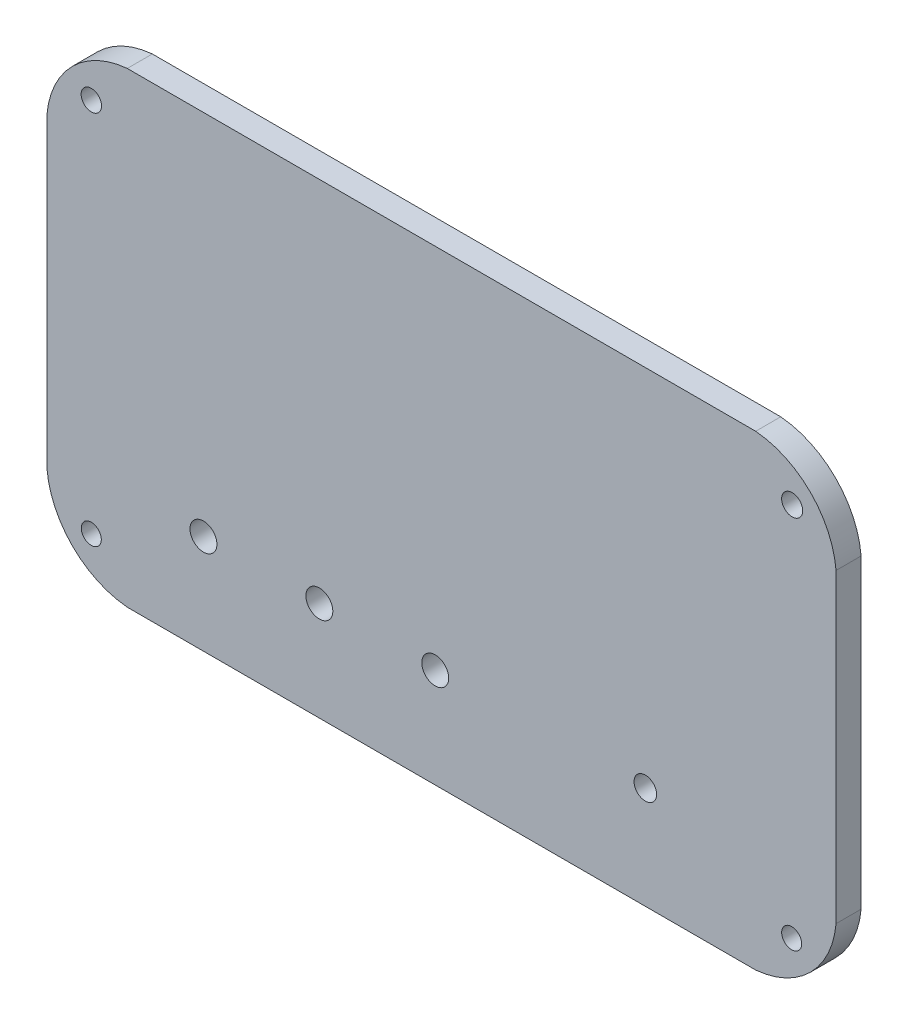
ISO-10303-21;
HEADER;
FILE_DESCRIPTION(('STEP AP214'),'2;1');
FILE_NAME('part.step','',(''),(''),'','','');
FILE_SCHEMA(('AUTOMOTIVE_DESIGN { 1 0 10303 214 1 1 1 1 }'));
ENDSEC;
DATA;
#1=APPLICATION_CONTEXT('core data for automotive mechanical design processes');
#2=APPLICATION_PROTOCOL_DEFINITION('international standard','automotive_design',2000,#1);
#3=PRODUCT_CONTEXT('',#1,'mechanical');
#4=PRODUCT('Part','Part','',(#3));
#5=PRODUCT_RELATED_PRODUCT_CATEGORY('part','',(#4));
#6=PRODUCT_DEFINITION_FORMATION('','',#4);
#7=PRODUCT_DEFINITION_CONTEXT('part definition',#1,'design');
#8=PRODUCT_DEFINITION('design','',#6,#7);
#9=PRODUCT_DEFINITION_SHAPE('','',#8);
#10=(LENGTH_UNIT() NAMED_UNIT(*) SI_UNIT(.MILLI.,.METRE.));
#11=(NAMED_UNIT(*) PLANE_ANGLE_UNIT() SI_UNIT($,.RADIAN.));
#12=(NAMED_UNIT(*) SI_UNIT($,.STERADIAN.) SOLID_ANGLE_UNIT());
#13=UNCERTAINTY_MEASURE_WITH_UNIT(LENGTH_MEASURE(1.E-05),#10,'distance_accuracy_value','');
#14=(GEOMETRIC_REPRESENTATION_CONTEXT(3) GLOBAL_UNCERTAINTY_ASSIGNED_CONTEXT((#13)) GLOBAL_UNIT_ASSIGNED_CONTEXT((#10,
#11,#12)) REPRESENTATION_CONTEXT('',''));
#15=CARTESIAN_POINT('',(0.,0.,0.));
#16=DIRECTION('',(0.,0.,1.));
#17=DIRECTION('',(1.,0.,0.));
#18=AXIS2_PLACEMENT_3D('',#15,#16,#17);
#19=CARTESIAN_POINT('',(48.9504839953527,24.6545343401466,4.));
#20=DIRECTION('',(0.,0.,-1.));
#21=DIRECTION('',(-1.,0.,0.));
#22=AXIS2_PLACEMENT_3D('',#19,#20,#21);
#23=CYLINDRICAL_SURFACE('',#22,14.1023275814752);
#24=CARTESIAN_POINT('',(48.9504839953527,24.6545343401466,0.));
#25=DIRECTION('',(0.,0.,1.));
#26=DIRECTION('',(-1.,0.,0.));
#27=AXIS2_PLACEMENT_3D('',#24,#25,#26);
#28=CIRCLE('',#27,14.1023275814752);
#29=CARTESIAN_POINT('',(63.,25.873855155353,0.));
#30=VERTEX_POINT('',#29);
#31=CARTESIAN_POINT('',(50.1698048105594,38.7040503447938,0.));
#32=VERTEX_POINT('',#31);
#33=EDGE_CURVE('E131',#30,#32,#28,.T.);
#34=ORIENTED_EDGE('',*,*,#33,.T.);
#35=DIRECTION('',(0.,0.,-1.));
#36=VECTOR('',#35,1.);
#37=CARTESIAN_POINT('',(50.1698048105594,38.7040503447938,4.));
#38=LINE('',#37,#36);
#39=CARTESIAN_POINT('',(50.1698048105594,38.7040503447938,4.));
#40=VERTEX_POINT('',#39);
#41=EDGE_CURVE('E11',#40,#32,#38,.T.);
#42=ORIENTED_EDGE('',*,*,#41,.F.);
#43=CARTESIAN_POINT('',(48.9504839953527,24.6545343401466,4.));
#44=DIRECTION('',(0.,0.,1.));
#45=DIRECTION('',(-1.,0.,0.));
#46=AXIS2_PLACEMENT_3D('',#43,#44,#45);
#47=CIRCLE('',#46,14.1023275814752);
#48=CARTESIAN_POINT('',(63.,25.873855155353,4.));
#49=VERTEX_POINT('',#48);
#50=EDGE_CURVE('E146',#49,#40,#47,.T.);
#51=ORIENTED_EDGE('',*,*,#50,.F.);
#52=DIRECTION('',(0.,0.,-1.));
#53=VECTOR('',#52,1.);
#54=CARTESIAN_POINT('',(63.,25.873855155353,4.));
#55=LINE('',#54,#53);
#56=EDGE_CURVE('E127',#49,#30,#55,.T.);
#57=ORIENTED_EDGE('',*,*,#56,.T.);
#58=EDGE_LOOP('',(#34,#42,#51,#57));
#59=FACE_BOUND('',#58,.T.);
#60=ADVANCED_FACE('F35',(#59),#23,.T.);
#61=CARTESIAN_POINT('',(50.1698048105594,38.7040503447938,4.));
#62=DIRECTION('',(0.,-1.,0.));
#63=DIRECTION('',(0.,0.,-1.));
#64=AXIS2_PLACEMENT_3D('',#61,#62,#63);
#65=PLANE('',#64);
#66=DIRECTION('',(-1.,0.,0.));
#67=VECTOR('',#66,1.);
#68=CARTESIAN_POINT('',(50.1698048105594,38.7040503447938,0.));
#69=LINE('',#68,#67);
#70=CARTESIAN_POINT('',(-50.1698048105592,38.7040503447938,0.));
#71=VERTEX_POINT('',#70);
#72=EDGE_CURVE('E134',#32,#71,#69,.T.);
#73=ORIENTED_EDGE('',*,*,#72,.T.);
#74=DIRECTION('',(0.,0.,-1.));
#75=VECTOR('',#74,1.);
#76=CARTESIAN_POINT('',(-50.1698048105592,38.7040503447938,4.));
#77=LINE('',#76,#75);
#78=CARTESIAN_POINT('',(-50.1698048105592,38.7040503447938,4.));
#79=VERTEX_POINT('',#78);
#80=EDGE_CURVE('E43',#79,#71,#77,.T.);
#81=ORIENTED_EDGE('',*,*,#80,.F.);
#82=DIRECTION('',(-1.,0.,0.));
#83=VECTOR('',#82,1.);
#84=CARTESIAN_POINT('',(50.1698048105594,38.7040503447938,4.));
#85=LINE('',#84,#83);
#86=EDGE_CURVE('E94',#40,#79,#85,.T.);
#87=ORIENTED_EDGE('',*,*,#86,.F.);
#88=ORIENTED_EDGE('',*,*,#41,.T.);
#89=EDGE_LOOP('',(#73,#81,#87,#88));
#90=FACE_BOUND('',#89,.T.);
#91=ADVANCED_FACE('F269',(#90),#65,.F.);
#92=CARTESIAN_POINT('',(-48.9504839953527,24.6545343401465,4.));
#93=DIRECTION('',(0.,0.,-1.));
#94=DIRECTION('',(-1.,0.,0.));
#95=AXIS2_PLACEMENT_3D('',#92,#93,#94);
#96=CYLINDRICAL_SURFACE('',#95,14.1023275814752);
#97=CARTESIAN_POINT('',(-48.9504839953527,24.6545343401465,0.));
#98=DIRECTION('',(0.,0.,1.));
#99=DIRECTION('',(1.,0.,0.));
#100=AXIS2_PLACEMENT_3D('',#97,#98,#99);
#101=CIRCLE('',#100,14.1023275814752);
#102=CARTESIAN_POINT('',(-63.,25.873855155353,0.));
#103=VERTEX_POINT('',#102);
#104=EDGE_CURVE('E137',#71,#103,#101,.T.);
#105=ORIENTED_EDGE('',*,*,#104,.T.);
#106=DIRECTION('',(0.,0.,-1.));
#107=VECTOR('',#106,1.);
#108=CARTESIAN_POINT('',(-63.,25.873855155353,4.));
#109=LINE('',#108,#107);
#110=CARTESIAN_POINT('',(-63.,25.873855155353,4.));
#111=VERTEX_POINT('',#110);
#112=EDGE_CURVE('E153',#111,#103,#109,.T.);
#113=ORIENTED_EDGE('',*,*,#112,.F.);
#114=CARTESIAN_POINT('',(-48.9504839953527,24.6545343401465,4.));
#115=DIRECTION('',(0.,0.,1.));
#116=DIRECTION('',(1.,0.,0.));
#117=AXIS2_PLACEMENT_3D('',#114,#115,#116);
#118=CIRCLE('',#117,14.1023275814752);
#119=EDGE_CURVE('E161',#79,#111,#118,.T.);
#120=ORIENTED_EDGE('',*,*,#119,.F.);
#121=ORIENTED_EDGE('',*,*,#80,.T.);
#122=EDGE_LOOP('',(#105,#113,#120,#121));
#123=FACE_BOUND('',#122,.T.);
#124=ADVANCED_FACE('F159',(#123),#96,.T.);
#125=CARTESIAN_POINT('',(-63.,25.873855155353,4.));
#126=DIRECTION('',(1.,0.,0.));
#127=DIRECTION('',(0.,0.,-1.));
#128=AXIS2_PLACEMENT_3D('',#125,#126,#127);
#129=PLANE('',#128);
#130=DIRECTION('',(0.,-1.,0.));
#131=VECTOR('',#130,1.);
#132=CARTESIAN_POINT('',(-63.,25.873855155353,0.));
#133=LINE('',#132,#131);
#134=CARTESIAN_POINT('',(-63.,-22.9657544657653,0.));
#135=VERTEX_POINT('',#134);
#136=EDGE_CURVE('E139',#103,#135,#133,.T.);
#137=ORIENTED_EDGE('',*,*,#136,.T.);
#138=DIRECTION('',(0.,0.,-1.));
#139=VECTOR('',#138,1.);
#140=CARTESIAN_POINT('',(-63.,-22.9657544657653,4.));
#141=LINE('',#140,#139);
#142=CARTESIAN_POINT('',(-63.,-22.9657544657653,4.));
#143=VERTEX_POINT('',#142);
#144=EDGE_CURVE('E150',#143,#135,#141,.T.);
#145=ORIENTED_EDGE('',*,*,#144,.F.);
#146=DIRECTION('',(0.,-1.,0.));
#147=VECTOR('',#146,1.);
#148=CARTESIAN_POINT('',(-63.,25.873855155353,4.));
#149=LINE('',#148,#147);
#150=EDGE_CURVE('E173',#111,#143,#149,.T.);
#151=ORIENTED_EDGE('',*,*,#150,.F.);
#152=ORIENTED_EDGE('',*,*,#112,.T.);
#153=EDGE_LOOP('',(#137,#145,#151,#152));
#154=FACE_BOUND('',#153,.T.);
#155=ADVANCED_FACE('F169',(#154),#129,.F.);
#156=CARTESIAN_POINT('',(-48.9504839953527,-21.7464336505589,4.));
#157=DIRECTION('',(0.,0.,-1.));
#158=DIRECTION('',(-1.,0.,0.));
#159=AXIS2_PLACEMENT_3D('',#156,#157,#158);
#160=CYLINDRICAL_SURFACE('',#159,14.1023275814752);
#161=CARTESIAN_POINT('',(-48.9504839953527,-21.7464336505589,0.));
#162=DIRECTION('',(0.,0.,1.));
#163=DIRECTION('',(-1.,0.,0.));
#164=AXIS2_PLACEMENT_3D('',#161,#162,#163);
#165=CIRCLE('',#164,14.1023275814752);
#166=CARTESIAN_POINT('',(-50.1698048105591,-35.7959496552062,0.));
#167=VERTEX_POINT('',#166);
#168=EDGE_CURVE('E141',#135,#167,#165,.T.);
#169=ORIENTED_EDGE('',*,*,#168,.T.);
#170=DIRECTION('',(0.,0.,-1.));
#171=VECTOR('',#170,1.);
#172=CARTESIAN_POINT('',(-50.1698048105591,-35.7959496552062,4.));
#173=LINE('',#172,#171);
#174=CARTESIAN_POINT('',(-50.1698048105591,-35.7959496552062,4.));
#175=VERTEX_POINT('',#174);
#176=EDGE_CURVE('E122',#175,#167,#173,.T.);
#177=ORIENTED_EDGE('',*,*,#176,.F.);
#178=CARTESIAN_POINT('',(-48.9504839953527,-21.7464336505589,4.));
#179=DIRECTION('',(0.,0.,1.));
#180=DIRECTION('',(-1.,0.,0.));
#181=AXIS2_PLACEMENT_3D('',#178,#179,#180);
#182=CIRCLE('',#181,14.1023275814752);
#183=EDGE_CURVE('E113',#143,#175,#182,.T.);
#184=ORIENTED_EDGE('',*,*,#183,.F.);
#185=ORIENTED_EDGE('',*,*,#144,.T.);
#186=EDGE_LOOP('',(#169,#177,#184,#185));
#187=FACE_BOUND('',#186,.T.);
#188=ADVANCED_FACE('F172',(#187),#160,.T.);
#189=CARTESIAN_POINT('',(-50.1698048105592,-35.7959496552062,4.));
#190=DIRECTION('',(0.,1.,0.));
#191=DIRECTION('',(0.,0.,1.));
#192=AXIS2_PLACEMENT_3D('',#189,#190,#191);
#193=PLANE('',#192);
#194=DIRECTION('',(1.,0.,0.));
#195=VECTOR('',#194,1.);
#196=CARTESIAN_POINT('',(-50.1698048105592,-35.7959496552062,0.));
#197=LINE('',#196,#195);
#198=CARTESIAN_POINT('',(50.1698048105594,-35.7959496552062,0.));
#199=VERTEX_POINT('',#198);
#200=EDGE_CURVE('E121',#167,#199,#197,.T.);
#201=ORIENTED_EDGE('',*,*,#200,.T.);
#202=DIRECTION('',(0.,0.,-1.));
#203=VECTOR('',#202,1.);
#204=CARTESIAN_POINT('',(50.1698048105594,-35.7959496552062,4.));
#205=LINE('',#204,#203);
#206=CARTESIAN_POINT('',(50.1698048105594,-35.7959496552062,4.));
#207=VERTEX_POINT('',#206);
#208=EDGE_CURVE('E118',#207,#199,#205,.T.);
#209=ORIENTED_EDGE('',*,*,#208,.F.);
#210=DIRECTION('',(1.,0.,0.));
#211=VECTOR('',#210,1.);
#212=CARTESIAN_POINT('',(-50.1698048105592,-35.7959496552062,4.));
#213=LINE('',#212,#211);
#214=EDGE_CURVE('E107',#175,#207,#213,.T.);
#215=ORIENTED_EDGE('',*,*,#214,.F.);
#216=ORIENTED_EDGE('',*,*,#176,.T.);
#217=EDGE_LOOP('',(#201,#209,#215,#216));
#218=FACE_BOUND('',#217,.T.);
#219=ADVANCED_FACE('F119',(#218),#193,.F.);
#220=CARTESIAN_POINT('',(48.9504839953527,-21.7464336505589,4.));
#221=DIRECTION('',(0.,0.,-1.));
#222=DIRECTION('',(-1.,0.,0.));
#223=AXIS2_PLACEMENT_3D('',#220,#221,#222);
#224=CYLINDRICAL_SURFACE('',#223,14.1023275814752);
#225=CARTESIAN_POINT('',(48.9504839953527,-21.7464336505589,0.));
#226=DIRECTION('',(0.,0.,1.));
#227=DIRECTION('',(1.,0.,0.));
#228=AXIS2_PLACEMENT_3D('',#225,#226,#227);
#229=CIRCLE('',#228,14.1023275814752);
#230=CARTESIAN_POINT('',(63.,-22.9657544657653,0.));
#231=VERTEX_POINT('',#230);
#232=EDGE_CURVE('E80',#199,#231,#229,.T.);
#233=ORIENTED_EDGE('',*,*,#232,.T.);
#234=DIRECTION('',(0.,0.,-1.));
#235=VECTOR('',#234,1.);
#236=CARTESIAN_POINT('',(63.,-22.9657544657653,4.));
#237=LINE('',#236,#235);
#238=CARTESIAN_POINT('',(63.,-22.9657544657653,4.));
#239=VERTEX_POINT('',#238);
#240=EDGE_CURVE('E123',#239,#231,#237,.T.);
#241=ORIENTED_EDGE('',*,*,#240,.F.);
#242=CARTESIAN_POINT('',(48.9504839953527,-21.7464336505589,4.));
#243=DIRECTION('',(0.,0.,1.));
#244=DIRECTION('',(1.,0.,0.));
#245=AXIS2_PLACEMENT_3D('',#242,#243,#244);
#246=CIRCLE('',#245,14.1023275814752);
#247=EDGE_CURVE('E111',#207,#239,#246,.T.);
#248=ORIENTED_EDGE('',*,*,#247,.F.);
#249=ORIENTED_EDGE('',*,*,#208,.T.);
#250=EDGE_LOOP('',(#233,#241,#248,#249));
#251=FACE_BOUND('',#250,.T.);
#252=ADVANCED_FACE('F125',(#251),#224,.T.);
#253=CARTESIAN_POINT('',(63.,-22.9657544657653,4.));
#254=DIRECTION('',(-1.,0.,0.));
#255=DIRECTION('',(0.,0.,1.));
#256=AXIS2_PLACEMENT_3D('',#253,#254,#255);
#257=PLANE('',#256);
#258=DIRECTION('',(0.,1.,0.));
#259=VECTOR('',#258,1.);
#260=CARTESIAN_POINT('',(63.,-22.9657544657653,0.));
#261=LINE('',#260,#259);
#262=EDGE_CURVE('E86',#231,#30,#261,.T.);
#263=ORIENTED_EDGE('',*,*,#262,.T.);
#264=ORIENTED_EDGE('',*,*,#56,.F.);
#265=DIRECTION('',(0.,1.,0.));
#266=VECTOR('',#265,1.);
#267=CARTESIAN_POINT('',(63.,-22.9657544657653,4.));
#268=LINE('',#267,#266);
#269=EDGE_CURVE('E51',#239,#49,#268,.T.);
#270=ORIENTED_EDGE('',*,*,#269,.F.);
#271=ORIENTED_EDGE('',*,*,#240,.T.);
#272=EDGE_LOOP('',(#263,#264,#270,#271));
#273=FACE_BOUND('',#272,.T.);
#274=ADVANCED_FACE('F259',(#273),#257,.F.);
#275=CARTESIAN_POINT('',(48.9504839953527,24.6545343401466,4.));
#276=DIRECTION('',(0.,0.,-1.));
#277=DIRECTION('',(-1.,0.,0.));
#278=AXIS2_PLACEMENT_3D('',#275,#276,#277);
#279=PLANE('',#278);
#280=CARTESIAN_POINT('',(-55.9052456302012,31.455233255895,4.));
#281=DIRECTION('',(0.,0.,-1.));
#282=DIRECTION('',(-1.,0.,0.));
#283=AXIS2_PLACEMENT_3D('',#280,#281,#282);
#284=CIRCLE('',#283,1.63184694028027);
#285=CARTESIAN_POINT('',(-57.5370925704815,31.455233255895,4.));
#286=VERTEX_POINT('',#285);
#287=EDGE_CURVE('E206',#286,#286,#284,.T.);
#288=ORIENTED_EDGE('',*,*,#287,.T.);
#289=EDGE_LOOP('',(#288));
#290=FACE_BOUND('',#289,.T.);
#291=CARTESIAN_POINT('',(55.9150267097706,-28.5168248430726,4.));
#292=DIRECTION('',(0.,0.,-1.));
#293=DIRECTION('',(-1.,0.,0.));
#294=AXIS2_PLACEMENT_3D('',#291,#292,#293);
#295=CIRCLE('',#294,1.59999999999996);
#296=CARTESIAN_POINT('',(54.3150267097706,-28.5168248430726,4.));
#297=VERTEX_POINT('',#296);
#298=EDGE_CURVE('E212',#297,#297,#295,.T.);
#299=ORIENTED_EDGE('',*,*,#298,.T.);
#300=EDGE_LOOP('',(#299));
#301=FACE_BOUND('',#300,.T.);
#302=CARTESIAN_POINT('',(-55.9150267097706,-28.5168248430726,4.));
#303=DIRECTION('',(0.,0.,-1.));
#304=DIRECTION('',(-1.,0.,0.));
#305=AXIS2_PLACEMENT_3D('',#302,#303,#304);
#306=CIRCLE('',#305,1.59999999999999);
#307=CARTESIAN_POINT('',(-57.5150267097706,-28.5168248430726,4.));
#308=VERTEX_POINT('',#307);
#309=EDGE_CURVE('E213',#308,#308,#306,.T.);
#310=ORIENTED_EDGE('',*,*,#309,.T.);
#311=EDGE_LOOP('',(#310));
#312=FACE_BOUND('',#311,.T.);
#313=CARTESIAN_POINT('',(55.9916196523817,31.455233255895,4.));
#314=DIRECTION('',(0.,0.,-1.));
#315=DIRECTION('',(-1.,0.,0.));
#316=AXIS2_PLACEMENT_3D('',#313,#314,#315);
#317=CIRCLE('',#316,1.68237123514881);
#318=CARTESIAN_POINT('',(54.3092484172328,31.455233255895,4.));
#319=VERTEX_POINT('',#318);
#320=EDGE_CURVE('E196',#319,#319,#317,.T.);
#321=ORIENTED_EDGE('',*,*,#320,.T.);
#322=EDGE_LOOP('',(#321));
#323=FACE_BOUND('',#322,.T.);
#324=CARTESIAN_POINT('',(-38.,-19.9459496552062,4.));
#325=DIRECTION('',(0.,0.,1.));
#326=DIRECTION('',(1.,0.,0.));
#327=AXIS2_PLACEMENT_3D('',#324,#325,#326);
#328=CIRCLE('',#327,2.15);
#329=CARTESIAN_POINT('',(-35.85,-19.9459496552062,4.));
#330=VERTEX_POINT('',#329);
#331=EDGE_CURVE('E192',#330,#330,#328,.T.);
#332=ORIENTED_EDGE('',*,*,#331,.F.);
#333=EDGE_LOOP('',(#332));
#334=FACE_BOUND('',#333,.T.);
#335=CARTESIAN_POINT('',(-1.00000000000003,-19.9459496552062,4.));
#336=DIRECTION('',(0.,0.,1.));
#337=DIRECTION('',(1.,0.,0.));
#338=AXIS2_PLACEMENT_3D('',#335,#336,#337);
#339=CIRCLE('',#338,2.15);
#340=CARTESIAN_POINT('',(1.14999999999997,-19.9459496552062,4.));
#341=VERTEX_POINT('',#340);
#342=EDGE_CURVE('E193',#341,#341,#339,.T.);
#343=ORIENTED_EDGE('',*,*,#342,.F.);
#344=EDGE_LOOP('',(#343));
#345=FACE_BOUND('',#344,.T.);
#346=CARTESIAN_POINT('',(-19.5,-19.9459496552062,4.));
#347=DIRECTION('',(0.,0.,1.));
#348=DIRECTION('',(1.,0.,0.));
#349=AXIS2_PLACEMENT_3D('',#346,#347,#348);
#350=CIRCLE('',#349,2.15);
#351=CARTESIAN_POINT('',(-17.35,-19.9459496552062,4.));
#352=VERTEX_POINT('',#351);
#353=EDGE_CURVE('E179',#352,#352,#350,.T.);
#354=ORIENTED_EDGE('',*,*,#353,.F.);
#355=EDGE_LOOP('',(#354));
#356=FACE_BOUND('',#355,.T.);
#357=CARTESIAN_POINT('',(32.5542275212656,-19.4425109087948,4.));
#358=DIRECTION('',(0.,0.,1.));
#359=DIRECTION('',(1.,0.,0.));
#360=AXIS2_PLACEMENT_3D('',#357,#358,#359);
#361=CIRCLE('',#360,1.8);
#362=CARTESIAN_POINT('',(34.3542275212656,-19.4425109087948,4.));
#363=VERTEX_POINT('',#362);
#364=EDGE_CURVE('E186',#363,#363,#361,.T.);
#365=ORIENTED_EDGE('',*,*,#364,.F.);
#366=EDGE_LOOP('',(#365));
#367=FACE_BOUND('',#366,.T.);
#368=ORIENTED_EDGE('',*,*,#50,.T.);
#369=ORIENTED_EDGE('',*,*,#86,.T.);
#370=ORIENTED_EDGE('',*,*,#119,.T.);
#371=ORIENTED_EDGE('',*,*,#150,.T.);
#372=ORIENTED_EDGE('',*,*,#183,.T.);
#373=ORIENTED_EDGE('',*,*,#214,.T.);
#374=ORIENTED_EDGE('',*,*,#247,.T.);
#375=ORIENTED_EDGE('',*,*,#269,.T.);
#376=EDGE_LOOP('',(#368,#369,#370,#371,#372,#373,#374,#375));
#377=FACE_BOUND('',#376,.T.);
#378=ADVANCED_FACE('F109',(#290,#301,#312,#323,#334,#345,#356,#367,#377),#279,.F.);
#379=CARTESIAN_POINT('',(48.9504839953527,24.6545343401466,0.));
#380=DIRECTION('',(0.,0.,-1.));
#381=DIRECTION('',(-1.,0.,0.));
#382=AXIS2_PLACEMENT_3D('',#379,#380,#381);
#383=PLANE('',#382);
#384=CARTESIAN_POINT('',(-55.9052456302012,31.455233255895,0.));
#385=DIRECTION('',(0.,0.,-1.));
#386=DIRECTION('',(-1.,0.,0.));
#387=AXIS2_PLACEMENT_3D('',#384,#385,#386);
#388=CIRCLE('',#387,1.63184694028027);
#389=CARTESIAN_POINT('',(-57.5370925704815,31.455233255895,0.));
#390=VERTEX_POINT('',#389);
#391=EDGE_CURVE('E216',#390,#390,#388,.T.);
#392=ORIENTED_EDGE('',*,*,#391,.F.);
#393=EDGE_LOOP('',(#392));
#394=FACE_BOUND('',#393,.T.);
#395=CARTESIAN_POINT('',(55.9150267097706,-28.5168248430726,0.));
#396=DIRECTION('',(0.,0.,-1.));
#397=DIRECTION('',(-1.,0.,0.));
#398=AXIS2_PLACEMENT_3D('',#395,#396,#397);
#399=CIRCLE('',#398,1.59999999999996);
#400=CARTESIAN_POINT('',(54.3150267097706,-28.5168248430726,0.));
#401=VERTEX_POINT('',#400);
#402=EDGE_CURVE('E209',#401,#401,#399,.T.);
#403=ORIENTED_EDGE('',*,*,#402,.F.);
#404=EDGE_LOOP('',(#403));
#405=FACE_BOUND('',#404,.T.);
#406=CARTESIAN_POINT('',(-55.9150267097706,-28.5168248430726,0.));
#407=DIRECTION('',(0.,0.,-1.));
#408=DIRECTION('',(-1.,0.,0.));
#409=AXIS2_PLACEMENT_3D('',#406,#407,#408);
#410=CIRCLE('',#409,1.59999999999999);
#411=CARTESIAN_POINT('',(-57.5150267097706,-28.5168248430726,0.));
#412=VERTEX_POINT('',#411);
#413=EDGE_CURVE('E221',#412,#412,#410,.T.);
#414=ORIENTED_EDGE('',*,*,#413,.F.);
#415=EDGE_LOOP('',(#414));
#416=FACE_BOUND('',#415,.T.);
#417=CARTESIAN_POINT('',(55.9916196523817,31.455233255895,0.));
#418=DIRECTION('',(0.,0.,-1.));
#419=DIRECTION('',(-1.,0.,0.));
#420=AXIS2_PLACEMENT_3D('',#417,#418,#419);
#421=CIRCLE('',#420,1.68237123514881);
#422=CARTESIAN_POINT('',(54.3092484172328,31.455233255895,0.));
#423=VERTEX_POINT('',#422);
#424=EDGE_CURVE('E203',#423,#423,#421,.T.);
#425=ORIENTED_EDGE('',*,*,#424,.F.);
#426=EDGE_LOOP('',(#425));
#427=FACE_BOUND('',#426,.T.);
#428=CARTESIAN_POINT('',(-38.,-19.9459496552062,0.));
#429=DIRECTION('',(0.,0.,1.));
#430=DIRECTION('',(1.,0.,0.));
#431=AXIS2_PLACEMENT_3D('',#428,#429,#430);
#432=CIRCLE('',#431,2.15);
#433=CARTESIAN_POINT('',(-35.85,-19.9459496552062,0.));
#434=VERTEX_POINT('',#433);
#435=EDGE_CURVE('E135',#434,#434,#432,.T.);
#436=ORIENTED_EDGE('',*,*,#435,.T.);
#437=EDGE_LOOP('',(#436));
#438=FACE_BOUND('',#437,.T.);
#439=CARTESIAN_POINT('',(-1.00000000000003,-19.9459496552062,0.));
#440=DIRECTION('',(0.,0.,1.));
#441=DIRECTION('',(1.,0.,0.));
#442=AXIS2_PLACEMENT_3D('',#439,#440,#441);
#443=CIRCLE('',#442,2.15);
#444=CARTESIAN_POINT('',(1.14999999999997,-19.9459496552062,0.));
#445=VERTEX_POINT('',#444);
#446=EDGE_CURVE('E183',#445,#445,#443,.T.);
#447=ORIENTED_EDGE('',*,*,#446,.T.);
#448=EDGE_LOOP('',(#447));
#449=FACE_BOUND('',#448,.T.);
#450=CARTESIAN_POINT('',(-19.5,-19.9459496552062,0.));
#451=DIRECTION('',(0.,0.,1.));
#452=DIRECTION('',(1.,0.,0.));
#453=AXIS2_PLACEMENT_3D('',#450,#451,#452);
#454=CIRCLE('',#453,2.15);
#455=CARTESIAN_POINT('',(-17.35,-19.9459496552062,0.));
#456=VERTEX_POINT('',#455);
#457=EDGE_CURVE('E182',#456,#456,#454,.T.);
#458=ORIENTED_EDGE('',*,*,#457,.T.);
#459=EDGE_LOOP('',(#458));
#460=FACE_BOUND('',#459,.T.);
#461=CARTESIAN_POINT('',(32.5542275212656,-19.4425109087948,0.));
#462=DIRECTION('',(0.,0.,1.));
#463=DIRECTION('',(1.,0.,0.));
#464=AXIS2_PLACEMENT_3D('',#461,#462,#463);
#465=CIRCLE('',#464,1.8);
#466=CARTESIAN_POINT('',(34.3542275212656,-19.4425109087948,0.));
#467=VERTEX_POINT('',#466);
#468=EDGE_CURVE('E189',#467,#467,#465,.T.);
#469=ORIENTED_EDGE('',*,*,#468,.T.);
#470=EDGE_LOOP('',(#469));
#471=FACE_BOUND('',#470,.T.);
#472=ORIENTED_EDGE('',*,*,#33,.F.);
#473=ORIENTED_EDGE('',*,*,#262,.F.);
#474=ORIENTED_EDGE('',*,*,#232,.F.);
#475=ORIENTED_EDGE('',*,*,#200,.F.);
#476=ORIENTED_EDGE('',*,*,#168,.F.);
#477=ORIENTED_EDGE('',*,*,#136,.F.);
#478=ORIENTED_EDGE('',*,*,#104,.F.);
#479=ORIENTED_EDGE('',*,*,#72,.F.);
#480=EDGE_LOOP('',(#472,#473,#474,#475,#476,#477,#478,#479));
#481=FACE_BOUND('',#480,.T.);
#482=ADVANCED_FACE('F165',(#394,#405,#416,#427,#438,#449,#460,#471,#481),#383,.T.);
#483=CARTESIAN_POINT('',(32.5542275212656,-19.4425109087948,0.));
#484=DIRECTION('',(0.,0.,1.));
#485=DIRECTION('',(1.,0.,0.));
#486=AXIS2_PLACEMENT_3D('',#483,#484,#485);
#487=CYLINDRICAL_SURFACE('',#486,1.8);
#488=ORIENTED_EDGE('',*,*,#468,.F.);
#489=EDGE_LOOP('',(#488));
#490=FACE_BOUND('',#489,.T.);
#491=ORIENTED_EDGE('',*,*,#364,.T.);
#492=EDGE_LOOP('',(#491));
#493=FACE_BOUND('',#492,.T.);
#494=ADVANCED_FACE('F239',(#490,#493),#487,.F.);
#495=CARTESIAN_POINT('',(-19.5,-19.9459496552062,0.));
#496=DIRECTION('',(0.,0.,1.));
#497=DIRECTION('',(1.,0.,0.));
#498=AXIS2_PLACEMENT_3D('',#495,#496,#497);
#499=CYLINDRICAL_SURFACE('',#498,2.15);
#500=ORIENTED_EDGE('',*,*,#457,.F.);
#501=EDGE_LOOP('',(#500));
#502=FACE_BOUND('',#501,.T.);
#503=ORIENTED_EDGE('',*,*,#353,.T.);
#504=EDGE_LOOP('',(#503));
#505=FACE_BOUND('',#504,.T.);
#506=ADVANCED_FACE('F254',(#502,#505),#499,.F.);
#507=CARTESIAN_POINT('',(-1.00000000000003,-19.9459496552062,0.));
#508=DIRECTION('',(0.,0.,1.));
#509=DIRECTION('',(1.,0.,0.));
#510=AXIS2_PLACEMENT_3D('',#507,#508,#509);
#511=CYLINDRICAL_SURFACE('',#510,2.15);
#512=ORIENTED_EDGE('',*,*,#446,.F.);
#513=EDGE_LOOP('',(#512));
#514=FACE_BOUND('',#513,.T.);
#515=ORIENTED_EDGE('',*,*,#342,.T.);
#516=EDGE_LOOP('',(#515));
#517=FACE_BOUND('',#516,.T.);
#518=ADVANCED_FACE('F313',(#514,#517),#511,.F.);
#519=CARTESIAN_POINT('',(-38.,-19.9459496552062,0.));
#520=DIRECTION('',(0.,0.,1.));
#521=DIRECTION('',(1.,0.,0.));
#522=AXIS2_PLACEMENT_3D('',#519,#520,#521);
#523=CYLINDRICAL_SURFACE('',#522,2.15);
#524=ORIENTED_EDGE('',*,*,#435,.F.);
#525=EDGE_LOOP('',(#524));
#526=FACE_BOUND('',#525,.T.);
#527=ORIENTED_EDGE('',*,*,#331,.T.);
#528=EDGE_LOOP('',(#527));
#529=FACE_BOUND('',#528,.T.);
#530=ADVANCED_FACE('F322',(#526,#529),#523,.F.);
#531=CARTESIAN_POINT('',(55.9916196523817,31.455233255895,4.));
#532=DIRECTION('',(0.,0.,-1.));
#533=DIRECTION('',(-1.,0.,0.));
#534=AXIS2_PLACEMENT_3D('',#531,#532,#533);
#535=CYLINDRICAL_SURFACE('',#534,1.68237123514881);
#536=ORIENTED_EDGE('',*,*,#320,.F.);
#537=EDGE_LOOP('',(#536));
#538=FACE_BOUND('',#537,.T.);
#539=ORIENTED_EDGE('',*,*,#424,.T.);
#540=EDGE_LOOP('',(#539));
#541=FACE_BOUND('',#540,.T.);
#542=ADVANCED_FACE('F233',(#538,#541),#535,.F.);
#543=CARTESIAN_POINT('',(-55.9150267097706,-28.5168248430726,4.));
#544=DIRECTION('',(0.,0.,-1.));
#545=DIRECTION('',(-1.,0.,0.));
#546=AXIS2_PLACEMENT_3D('',#543,#544,#545);
#547=CYLINDRICAL_SURFACE('',#546,1.59999999999999);
#548=ORIENTED_EDGE('',*,*,#309,.F.);
#549=EDGE_LOOP('',(#548));
#550=FACE_BOUND('',#549,.T.);
#551=ORIENTED_EDGE('',*,*,#413,.T.);
#552=EDGE_LOOP('',(#551));
#553=FACE_BOUND('',#552,.T.);
#554=ADVANCED_FACE('F229',(#550,#553),#547,.F.);
#555=CARTESIAN_POINT('',(55.9150267097706,-28.5168248430726,4.));
#556=DIRECTION('',(0.,0.,-1.));
#557=DIRECTION('',(-1.,0.,0.));
#558=AXIS2_PLACEMENT_3D('',#555,#556,#557);
#559=CYLINDRICAL_SURFACE('',#558,1.59999999999996);
#560=ORIENTED_EDGE('',*,*,#298,.F.);
#561=EDGE_LOOP('',(#560));
#562=FACE_BOUND('',#561,.T.);
#563=ORIENTED_EDGE('',*,*,#402,.T.);
#564=EDGE_LOOP('',(#563));
#565=FACE_BOUND('',#564,.T.);
#566=ADVANCED_FACE('F232',(#562,#565),#559,.F.);
#567=CARTESIAN_POINT('',(-55.9052456302012,31.455233255895,4.));
#568=DIRECTION('',(0.,0.,-1.));
#569=DIRECTION('',(-1.,0.,0.));
#570=AXIS2_PLACEMENT_3D('',#567,#568,#569);
#571=CYLINDRICAL_SURFACE('',#570,1.63184694028027);
#572=ORIENTED_EDGE('',*,*,#287,.F.);
#573=EDGE_LOOP('',(#572));
#574=FACE_BOUND('',#573,.T.);
#575=ORIENTED_EDGE('',*,*,#391,.T.);
#576=EDGE_LOOP('',(#575));
#577=FACE_BOUND('',#576,.T.);
#578=ADVANCED_FACE('F364',(#574,#577),#571,.F.);
#579=CLOSED_SHELL('',(#60,#91,#124,#155,#188,#219,#252,#274,#378,#482,#494,#506,#518,#530,#542,
#554,#566,#578));
#580=MANIFOLD_SOLID_BREP('B2',#579);
#581=ADVANCED_BREP_SHAPE_REPRESENTATION('',(#18,#580),#14);
#582=SHAPE_DEFINITION_REPRESENTATION(#9,#581);
ENDSEC;
END-ISO-10303-21;
